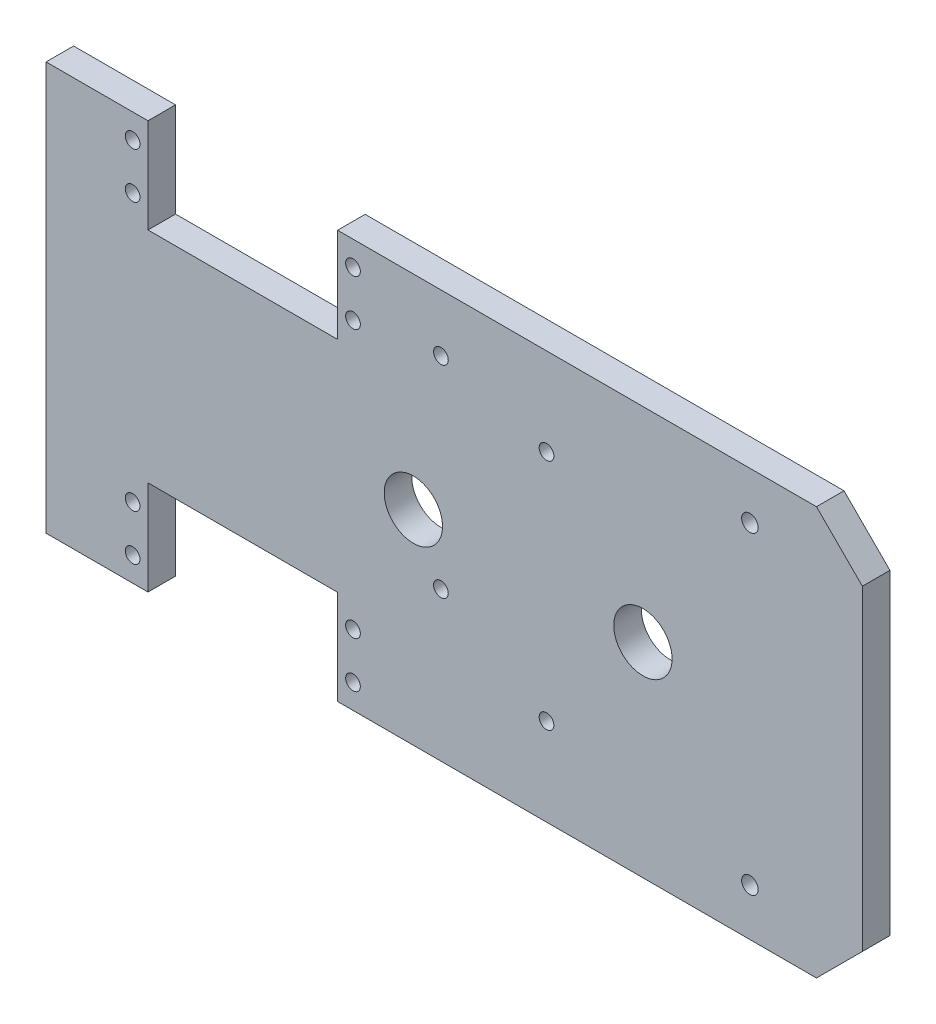
ISO-10303-21;
HEADER;
FILE_DESCRIPTION(('STEP AP214'),'2;1');
FILE_NAME('part.step','',(''),(''),'','','');
FILE_SCHEMA(('AUTOMOTIVE_DESIGN { 1 0 10303 214 1 1 1 1 }'));
ENDSEC;
DATA;
#1=APPLICATION_CONTEXT('core data for automotive mechanical design processes');
#2=APPLICATION_PROTOCOL_DEFINITION('international standard','automotive_design',2000,#1);
#3=PRODUCT_CONTEXT('',#1,'mechanical');
#4=PRODUCT('Part','Part','',(#3));
#5=PRODUCT_RELATED_PRODUCT_CATEGORY('part','',(#4));
#6=PRODUCT_DEFINITION_FORMATION('','',#4);
#7=PRODUCT_DEFINITION_CONTEXT('part definition',#1,'design');
#8=PRODUCT_DEFINITION('design','',#6,#7);
#9=PRODUCT_DEFINITION_SHAPE('','',#8);
#10=(LENGTH_UNIT() NAMED_UNIT(*) SI_UNIT(.MILLI.,.METRE.));
#11=(NAMED_UNIT(*) PLANE_ANGLE_UNIT() SI_UNIT($,.RADIAN.));
#12=(NAMED_UNIT(*) SI_UNIT($,.STERADIAN.) SOLID_ANGLE_UNIT());
#13=UNCERTAINTY_MEASURE_WITH_UNIT(LENGTH_MEASURE(1.E-05),#10,'distance_accuracy_value','');
#14=(GEOMETRIC_REPRESENTATION_CONTEXT(3) GLOBAL_UNCERTAINTY_ASSIGNED_CONTEXT((#13)) GLOBAL_UNIT_ASSIGNED_CONTEXT((#10,
#11,#12)) REPRESENTATION_CONTEXT('',''));
#15=CARTESIAN_POINT('',(0.,0.,0.));
#16=DIRECTION('',(0.,0.,1.));
#17=DIRECTION('',(1.,0.,0.));
#18=AXIS2_PLACEMENT_3D('',#15,#16,#17);
#19=CARTESIAN_POINT('',(0.,0.,6.));
#20=DIRECTION('',(0.,0.,1.));
#21=DIRECTION('',(1.,0.,0.));
#22=AXIS2_PLACEMENT_3D('',#19,#20,#21);
#23=PLANE('',#22);
#24=CARTESIAN_POINT('',(80.,0.,6.));
#25=DIRECTION('',(0.,0.,1.));
#26=DIRECTION('',(1.,0.,0.));
#27=AXIS2_PLACEMENT_3D('',#24,#25,#26);
#28=CIRCLE('',#27,6.34999999999999);
#29=CARTESIAN_POINT('',(86.35,0.,6.));
#30=VERTEX_POINT('',#29);
#31=EDGE_CURVE('E371',#30,#30,#28,.T.);
#32=ORIENTED_EDGE('',*,*,#31,.F.);
#33=EDGE_LOOP('',(#32));
#34=FACE_BOUND('',#33,.T.);
#35=CARTESIAN_POINT('',(86.,-12.,6.));
#36=DIRECTION('',(0.,0.,1.));
#37=DIRECTION('',(1.,0.,0.));
#38=AXIS2_PLACEMENT_3D('',#35,#36,#37);
#39=CIRCLE('',#38,1.6);
#40=CARTESIAN_POINT('',(87.6,-12.,6.));
#41=VERTEX_POINT('',#40);
#42=EDGE_CURVE('E382',#41,#41,#39,.T.);
#43=ORIENTED_EDGE('',*,*,#42,.F.);
#44=EDGE_LOOP('',(#43));
#45=FACE_BOUND('',#44,.T.);
#46=CARTESIAN_POINT('',(153.3,-34.15,6.));
#47=DIRECTION('',(0.,0.,1.));
#48=DIRECTION('',(1.,0.,0.));
#49=AXIS2_PLACEMENT_3D('',#46,#47,#48);
#50=CIRCLE('',#49,1.8);
#51=CARTESIAN_POINT('',(155.1,-34.15,6.));
#52=VERTEX_POINT('',#51);
#53=EDGE_CURVE('E393',#52,#52,#50,.T.);
#54=ORIENTED_EDGE('',*,*,#53,.F.);
#55=EDGE_LOOP('',(#54));
#56=FACE_BOUND('',#55,.T.);
#57=CARTESIAN_POINT('',(66.85,-29.15,6.));
#58=DIRECTION('',(0.,0.,1.));
#59=DIRECTION('',(1.,0.,0.));
#60=AXIS2_PLACEMENT_3D('',#57,#58,#59);
#61=CIRCLE('',#60,1.6);
#62=CARTESIAN_POINT('',(68.45,-29.15,6.));
#63=VERTEX_POINT('',#62);
#64=EDGE_CURVE('E410',#63,#63,#61,.T.);
#65=ORIENTED_EDGE('',*,*,#64,.F.);
#66=EDGE_LOOP('',(#65));
#67=FACE_BOUND('',#66,.T.);
#68=CARTESIAN_POINT('',(18.85,-29.15,6.));
#69=DIRECTION('',(0.,0.,1.));
#70=DIRECTION('',(1.,0.,0.));
#71=AXIS2_PLACEMENT_3D('',#68,#69,#70);
#72=CIRCLE('',#71,1.6);
#73=CARTESIAN_POINT('',(20.45,-29.15,6.));
#74=VERTEX_POINT('',#73);
#75=EDGE_CURVE('E420',#74,#74,#72,.T.);
#76=ORIENTED_EDGE('',*,*,#75,.F.);
#77=EDGE_LOOP('',(#76));
#78=FACE_BOUND('',#77,.T.);
#79=CARTESIAN_POINT('',(153.3,34.15,6.));
#80=DIRECTION('',(0.,0.,1.));
#81=DIRECTION('',(1.,0.,0.));
#82=AXIS2_PLACEMENT_3D('',#79,#80,#81);
#83=CIRCLE('',#82,1.8);
#84=CARTESIAN_POINT('',(155.1,34.15,6.));
#85=VERTEX_POINT('',#84);
#86=EDGE_CURVE('E431',#85,#85,#83,.T.);
#87=ORIENTED_EDGE('',*,*,#86,.F.);
#88=EDGE_LOOP('',(#87));
#89=FACE_BOUND('',#88,.T.);
#90=CARTESIAN_POINT('',(66.85,29.15,6.));
#91=DIRECTION('',(0.,0.,1.));
#92=DIRECTION('',(1.,0.,0.));
#93=AXIS2_PLACEMENT_3D('',#90,#91,#92);
#94=CIRCLE('',#93,1.6);
#95=CARTESIAN_POINT('',(68.45,29.15,6.));
#96=VERTEX_POINT('',#95);
#97=EDGE_CURVE('E444',#96,#96,#94,.T.);
#98=ORIENTED_EDGE('',*,*,#97,.F.);
#99=EDGE_LOOP('',(#98));
#100=FACE_BOUND('',#99,.T.);
#101=CARTESIAN_POINT('',(18.85,29.15,6.));
#102=DIRECTION('',(0.,0.,1.));
#103=DIRECTION('',(1.,0.,0.));
#104=AXIS2_PLACEMENT_3D('',#101,#102,#103);
#105=CIRCLE('',#104,1.6);
#106=CARTESIAN_POINT('',(20.45,29.15,6.));
#107=VERTEX_POINT('',#106);
#108=EDGE_CURVE('E176',#107,#107,#105,.T.);
#109=ORIENTED_EDGE('',*,*,#108,.F.);
#110=EDGE_LOOP('',(#109));
#111=FACE_BOUND('',#110,.T.);
#112=DIRECTION('',(0.,-1.,0.));
#113=VECTOR('',#112,1.);
#114=CARTESIAN_POINT('',(0.,44.45,6.));
#115=LINE('',#114,#113);
#116=CARTESIAN_POINT('',(0.,44.45,6.));
#117=VERTEX_POINT('',#116);
#118=CARTESIAN_POINT('',(0.,-44.45,6.));
#119=VERTEX_POINT('',#118);
#120=EDGE_CURVE('E200',#117,#119,#115,.T.);
#121=ORIENTED_EDGE('',*,*,#120,.T.);
#122=DIRECTION('',(1.,0.,0.));
#123=VECTOR('',#122,1.);
#124=CARTESIAN_POINT('',(0.,-44.45,6.));
#125=LINE('',#124,#123);
#126=CARTESIAN_POINT('',(22.2,-44.45,6.));
#127=VERTEX_POINT('',#126);
#128=EDGE_CURVE('E120',#119,#127,#125,.T.);
#129=ORIENTED_EDGE('',*,*,#128,.T.);
#130=DIRECTION('',(0.,1.,0.));
#131=VECTOR('',#130,1.);
#132=CARTESIAN_POINT('',(22.2,-44.45,6.));
#133=LINE('',#132,#131);
#134=CARTESIAN_POINT('',(22.2,-23.85,6.));
#135=VERTEX_POINT('',#134);
#136=EDGE_CURVE('E235',#127,#135,#133,.T.);
#137=ORIENTED_EDGE('',*,*,#136,.T.);
#138=DIRECTION('',(1.,0.,0.));
#139=VECTOR('',#138,1.);
#140=CARTESIAN_POINT('',(22.2,-23.85,6.));
#141=LINE('',#140,#139);
#142=CARTESIAN_POINT('',(63.5,-23.85,6.));
#143=VERTEX_POINT('',#142);
#144=EDGE_CURVE('E253',#135,#143,#141,.T.);
#145=ORIENTED_EDGE('',*,*,#144,.T.);
#146=DIRECTION('',(0.,-1.,0.));
#147=VECTOR('',#146,1.);
#148=CARTESIAN_POINT('',(63.5,-23.85,6.));
#149=LINE('',#148,#147);
#150=CARTESIAN_POINT('',(63.5,-44.45,6.));
#151=VERTEX_POINT('',#150);
#152=EDGE_CURVE('E247',#143,#151,#149,.T.);
#153=ORIENTED_EDGE('',*,*,#152,.T.);
#154=DIRECTION('',(1.,0.,0.));
#155=VECTOR('',#154,1.);
#156=CARTESIAN_POINT('',(63.5,-44.45,6.));
#157=LINE('',#156,#155);
#158=CARTESIAN_POINT('',(167.8,-44.45,6.));
#159=VERTEX_POINT('',#158);
#160=EDGE_CURVE('E249',#151,#159,#157,.T.);
#161=ORIENTED_EDGE('',*,*,#160,.T.);
#162=DIRECTION('',(0.707106781186548,0.707106781186547,0.));
#163=VECTOR('',#162,1.);
#164=CARTESIAN_POINT('',(167.8,-44.45,6.));
#165=LINE('',#164,#163);
#166=CARTESIAN_POINT('',(177.8,-34.45,6.));
#167=VERTEX_POINT('',#166);
#168=EDGE_CURVE('E251',#159,#167,#165,.T.);
#169=ORIENTED_EDGE('',*,*,#168,.T.);
#170=DIRECTION('',(0.,1.,0.));
#171=VECTOR('',#170,1.);
#172=CARTESIAN_POINT('',(177.8,-34.45,6.));
#173=LINE('',#172,#171);
#174=CARTESIAN_POINT('',(177.8,34.45,6.));
#175=VERTEX_POINT('',#174);
#176=EDGE_CURVE('E259',#167,#175,#173,.T.);
#177=ORIENTED_EDGE('',*,*,#176,.T.);
#178=DIRECTION('',(-0.707106781186548,0.707106781186547,0.));
#179=VECTOR('',#178,1.);
#180=CARTESIAN_POINT('',(177.8,34.45,6.));
#181=LINE('',#180,#179);
#182=CARTESIAN_POINT('',(167.8,44.45,6.));
#183=VERTEX_POINT('',#182);
#184=EDGE_CURVE('E261',#175,#183,#181,.T.);
#185=ORIENTED_EDGE('',*,*,#184,.T.);
#186=DIRECTION('',(-1.,0.,0.));
#187=VECTOR('',#186,1.);
#188=CARTESIAN_POINT('',(167.8,44.45,6.));
#189=LINE('',#188,#187);
#190=CARTESIAN_POINT('',(63.5,44.45,6.));
#191=VERTEX_POINT('',#190);
#192=EDGE_CURVE('E263',#183,#191,#189,.T.);
#193=ORIENTED_EDGE('',*,*,#192,.T.);
#194=DIRECTION('',(0.,-1.,0.));
#195=VECTOR('',#194,1.);
#196=CARTESIAN_POINT('',(63.5,44.45,6.));
#197=LINE('',#196,#195);
#198=CARTESIAN_POINT('',(63.5,23.85,6.));
#199=VERTEX_POINT('',#198);
#200=EDGE_CURVE('E152',#191,#199,#197,.T.);
#201=ORIENTED_EDGE('',*,*,#200,.T.);
#202=DIRECTION('',(-1.,0.,0.));
#203=VECTOR('',#202,1.);
#204=CARTESIAN_POINT('',(63.5,23.85,6.));
#205=LINE('',#204,#203);
#206=CARTESIAN_POINT('',(22.2,23.85,6.));
#207=VERTEX_POINT('',#206);
#208=EDGE_CURVE('E146',#199,#207,#205,.T.);
#209=ORIENTED_EDGE('',*,*,#208,.T.);
#210=DIRECTION('',(0.,1.,0.));
#211=VECTOR('',#210,1.);
#212=CARTESIAN_POINT('',(22.2,23.85,6.));
#213=LINE('',#212,#211);
#214=CARTESIAN_POINT('',(22.2,44.45,6.));
#215=VERTEX_POINT('',#214);
#216=EDGE_CURVE('E155',#207,#215,#213,.T.);
#217=ORIENTED_EDGE('',*,*,#216,.T.);
#218=DIRECTION('',(-1.,0.,0.));
#219=VECTOR('',#218,1.);
#220=CARTESIAN_POINT('',(22.2,44.45,6.));
#221=LINE('',#220,#219);
#222=EDGE_CURVE('E57',#215,#117,#221,.T.);
#223=ORIENTED_EDGE('',*,*,#222,.T.);
#224=EDGE_LOOP('',(#121,#129,#137,#145,#153,#161,#169,#177,#185,#193,#201,#209,#217,#223));
#225=FACE_BOUND('',#224,.T.);
#226=CARTESIAN_POINT('',(18.85,39.15,6.));
#227=DIRECTION('',(0.,0.,1.));
#228=DIRECTION('',(1.,0.,0.));
#229=AXIS2_PLACEMENT_3D('',#226,#227,#228);
#230=CIRCLE('',#229,1.6);
#231=CARTESIAN_POINT('',(20.45,39.15,6.));
#232=VERTEX_POINT('',#231);
#233=EDGE_CURVE('E446',#232,#232,#230,.T.);
#234=ORIENTED_EDGE('',*,*,#233,.F.);
#235=EDGE_LOOP('',(#234));
#236=FACE_BOUND('',#235,.T.);
#237=CARTESIAN_POINT('',(66.85,39.15,6.));
#238=DIRECTION('',(0.,0.,1.));
#239=DIRECTION('',(1.,0.,0.));
#240=AXIS2_PLACEMENT_3D('',#237,#238,#239);
#241=CIRCLE('',#240,1.6);
#242=CARTESIAN_POINT('',(68.45,39.15,6.));
#243=VERTEX_POINT('',#242);
#244=EDGE_CURVE('E440',#243,#243,#241,.T.);
#245=ORIENTED_EDGE('',*,*,#244,.F.);
#246=EDGE_LOOP('',(#245));
#247=FACE_BOUND('',#246,.T.);
#248=CARTESIAN_POINT('',(109.,25.4,6.));
#249=DIRECTION('',(0.,0.,1.));
#250=DIRECTION('',(1.,0.,0.));
#251=AXIS2_PLACEMENT_3D('',#248,#249,#250);
#252=CIRCLE('',#251,1.6);
#253=CARTESIAN_POINT('',(110.6,25.4,6.));
#254=VERTEX_POINT('',#253);
#255=EDGE_CURVE('E422',#254,#254,#252,.T.);
#256=ORIENTED_EDGE('',*,*,#255,.F.);
#257=EDGE_LOOP('',(#256));
#258=FACE_BOUND('',#257,.T.);
#259=CARTESIAN_POINT('',(18.85,-39.15,6.));
#260=DIRECTION('',(0.,0.,1.));
#261=DIRECTION('',(1.,0.,0.));
#262=AXIS2_PLACEMENT_3D('',#259,#260,#261);
#263=CIRCLE('',#262,1.6);
#264=CARTESIAN_POINT('',(20.45,-39.15,6.));
#265=VERTEX_POINT('',#264);
#266=EDGE_CURVE('E412',#265,#265,#263,.T.);
#267=ORIENTED_EDGE('',*,*,#266,.F.);
#268=EDGE_LOOP('',(#267));
#269=FACE_BOUND('',#268,.T.);
#270=CARTESIAN_POINT('',(66.85,-39.15,6.));
#271=DIRECTION('',(0.,0.,1.));
#272=DIRECTION('',(1.,0.,0.));
#273=AXIS2_PLACEMENT_3D('',#270,#271,#272);
#274=CIRCLE('',#273,1.6);
#275=CARTESIAN_POINT('',(68.45,-39.15,6.));
#276=VERTEX_POINT('',#275);
#277=EDGE_CURVE('E402',#276,#276,#274,.T.);
#278=ORIENTED_EDGE('',*,*,#277,.F.);
#279=EDGE_LOOP('',(#278));
#280=FACE_BOUND('',#279,.T.);
#281=CARTESIAN_POINT('',(109.,-25.4,6.));
#282=DIRECTION('',(0.,0.,1.));
#283=DIRECTION('',(1.,0.,0.));
#284=AXIS2_PLACEMENT_3D('',#281,#282,#283);
#285=CIRCLE('',#284,1.6);
#286=CARTESIAN_POINT('',(110.6,-25.4,6.));
#287=VERTEX_POINT('',#286);
#288=EDGE_CURVE('E386',#287,#287,#285,.T.);
#289=ORIENTED_EDGE('',*,*,#288,.F.);
#290=EDGE_LOOP('',(#289));
#291=FACE_BOUND('',#290,.T.);
#292=CARTESIAN_POINT('',(86.,32.,6.));
#293=DIRECTION('',(0.,0.,1.));
#294=DIRECTION('',(1.,0.,0.));
#295=AXIS2_PLACEMENT_3D('',#292,#293,#294);
#296=CIRCLE('',#295,1.6);
#297=CARTESIAN_POINT('',(87.6,32.,6.));
#298=VERTEX_POINT('',#297);
#299=EDGE_CURVE('E380',#298,#298,#296,.T.);
#300=ORIENTED_EDGE('',*,*,#299,.F.);
#301=EDGE_LOOP('',(#300));
#302=FACE_BOUND('',#301,.T.);
#303=CARTESIAN_POINT('',(130.,0.,6.));
#304=DIRECTION('',(0.,0.,1.));
#305=DIRECTION('',(1.,0.,0.));
#306=AXIS2_PLACEMENT_3D('',#303,#304,#305);
#307=CIRCLE('',#306,6.34999999999999);
#308=CARTESIAN_POINT('',(136.35,0.,6.));
#309=VERTEX_POINT('',#308);
#310=EDGE_CURVE('E362',#309,#309,#307,.T.);
#311=ORIENTED_EDGE('',*,*,#310,.F.);
#312=EDGE_LOOP('',(#311));
#313=FACE_BOUND('',#312,.T.);
#314=ADVANCED_FACE('F39',(#34,#45,#56,#67,#78,#89,#100,#111,#225,#236,#247,#258,#269,#280,#291,
#302,#313),#23,.T.);
#315=CARTESIAN_POINT('',(0.,0.,0.));
#316=DIRECTION('',(0.,0.,1.));
#317=DIRECTION('',(1.,0.,0.));
#318=AXIS2_PLACEMENT_3D('',#315,#316,#317);
#319=PLANE('',#318);
#320=DIRECTION('',(0.,-1.,0.));
#321=VECTOR('',#320,1.);
#322=CARTESIAN_POINT('',(0.,44.45,0.));
#323=LINE('',#322,#321);
#324=CARTESIAN_POINT('',(0.,44.45,0.));
#325=VERTEX_POINT('',#324);
#326=CARTESIAN_POINT('',(0.,-44.45,0.));
#327=VERTEX_POINT('',#326);
#328=EDGE_CURVE('E175',#325,#327,#323,.T.);
#329=ORIENTED_EDGE('',*,*,#328,.F.);
#330=DIRECTION('',(-1.,0.,0.));
#331=VECTOR('',#330,1.);
#332=CARTESIAN_POINT('',(22.2,44.45,0.));
#333=LINE('',#332,#331);
#334=CARTESIAN_POINT('',(22.2,44.45,0.));
#335=VERTEX_POINT('',#334);
#336=EDGE_CURVE('E108',#335,#325,#333,.T.);
#337=ORIENTED_EDGE('',*,*,#336,.F.);
#338=DIRECTION('',(0.,1.,0.));
#339=VECTOR('',#338,1.);
#340=CARTESIAN_POINT('',(22.2,23.85,0.));
#341=LINE('',#340,#339);
#342=CARTESIAN_POINT('',(22.2,23.85,0.));
#343=VERTEX_POINT('',#342);
#344=EDGE_CURVE('E103',#343,#335,#341,.T.);
#345=ORIENTED_EDGE('',*,*,#344,.F.);
#346=DIRECTION('',(-1.,0.,0.));
#347=VECTOR('',#346,1.);
#348=CARTESIAN_POINT('',(63.5,23.85,0.));
#349=LINE('',#348,#347);
#350=CARTESIAN_POINT('',(63.5,23.85,0.));
#351=VERTEX_POINT('',#350);
#352=EDGE_CURVE('E165',#351,#343,#349,.T.);
#353=ORIENTED_EDGE('',*,*,#352,.F.);
#354=DIRECTION('',(0.,-1.,0.));
#355=VECTOR('',#354,1.);
#356=CARTESIAN_POINT('',(63.5,44.45,0.));
#357=LINE('',#356,#355);
#358=CARTESIAN_POINT('',(63.5,44.45,0.));
#359=VERTEX_POINT('',#358);
#360=EDGE_CURVE('E193',#359,#351,#357,.T.);
#361=ORIENTED_EDGE('',*,*,#360,.F.);
#362=DIRECTION('',(-1.,0.,0.));
#363=VECTOR('',#362,1.);
#364=CARTESIAN_POINT('',(167.8,44.45,0.));
#365=LINE('',#364,#363);
#366=CARTESIAN_POINT('',(167.8,44.45,0.));
#367=VERTEX_POINT('',#366);
#368=EDGE_CURVE('E195',#367,#359,#365,.T.);
#369=ORIENTED_EDGE('',*,*,#368,.F.);
#370=DIRECTION('',(-0.707106781186548,0.707106781186547,0.));
#371=VECTOR('',#370,1.);
#372=CARTESIAN_POINT('',(177.8,34.45,0.));
#373=LINE('',#372,#371);
#374=CARTESIAN_POINT('',(177.8,34.45,0.));
#375=VERTEX_POINT('',#374);
#376=EDGE_CURVE('E188',#375,#367,#373,.T.);
#377=ORIENTED_EDGE('',*,*,#376,.F.);
#378=DIRECTION('',(0.,1.,0.));
#379=VECTOR('',#378,1.);
#380=CARTESIAN_POINT('',(177.8,-34.45,0.));
#381=LINE('',#380,#379);
#382=CARTESIAN_POINT('',(177.8,-34.45,0.));
#383=VERTEX_POINT('',#382);
#384=EDGE_CURVE('E189',#383,#375,#381,.T.);
#385=ORIENTED_EDGE('',*,*,#384,.F.);
#386=DIRECTION('',(0.707106781186548,0.707106781186547,0.));
#387=VECTOR('',#386,1.);
#388=CARTESIAN_POINT('',(167.8,-44.45,0.));
#389=LINE('',#388,#387);
#390=CARTESIAN_POINT('',(167.8,-44.45,0.));
#391=VERTEX_POINT('',#390);
#392=EDGE_CURVE('E187',#391,#383,#389,.T.);
#393=ORIENTED_EDGE('',*,*,#392,.F.);
#394=DIRECTION('',(1.,0.,0.));
#395=VECTOR('',#394,1.);
#396=CARTESIAN_POINT('',(63.5,-44.45,0.));
#397=LINE('',#396,#395);
#398=CARTESIAN_POINT('',(63.5,-44.45,0.));
#399=VERTEX_POINT('',#398);
#400=EDGE_CURVE('E184',#399,#391,#397,.T.);
#401=ORIENTED_EDGE('',*,*,#400,.F.);
#402=DIRECTION('',(0.,-1.,0.));
#403=VECTOR('',#402,1.);
#404=CARTESIAN_POINT('',(63.5,-23.85,0.));
#405=LINE('',#404,#403);
#406=CARTESIAN_POINT('',(63.5,-23.85,0.));
#407=VERTEX_POINT('',#406);
#408=EDGE_CURVE('E185',#407,#399,#405,.T.);
#409=ORIENTED_EDGE('',*,*,#408,.F.);
#410=DIRECTION('',(1.,0.,0.));
#411=VECTOR('',#410,1.);
#412=CARTESIAN_POINT('',(22.2,-23.85,0.));
#413=LINE('',#412,#411);
#414=CARTESIAN_POINT('',(22.2,-23.85,0.));
#415=VERTEX_POINT('',#414);
#416=EDGE_CURVE('E179',#415,#407,#413,.T.);
#417=ORIENTED_EDGE('',*,*,#416,.F.);
#418=DIRECTION('',(0.,1.,0.));
#419=VECTOR('',#418,1.);
#420=CARTESIAN_POINT('',(22.2,-44.45,0.));
#421=LINE('',#420,#419);
#422=CARTESIAN_POINT('',(22.2,-44.45,0.));
#423=VERTEX_POINT('',#422);
#424=EDGE_CURVE('E177',#423,#415,#421,.T.);
#425=ORIENTED_EDGE('',*,*,#424,.F.);
#426=DIRECTION('',(1.,0.,0.));
#427=VECTOR('',#426,1.);
#428=CARTESIAN_POINT('',(0.,-44.45,0.));
#429=LINE('',#428,#427);
#430=EDGE_CURVE('E173',#327,#423,#429,.T.);
#431=ORIENTED_EDGE('',*,*,#430,.F.);
#432=EDGE_LOOP('',(#329,#337,#345,#353,#361,#369,#377,#385,#393,#401,#409,#417,#425,#431));
#433=FACE_BOUND('',#432,.T.);
#434=CARTESIAN_POINT('',(18.85,29.15,0.));
#435=DIRECTION('',(0.,0.,1.));
#436=DIRECTION('',(1.,0.,0.));
#437=AXIS2_PLACEMENT_3D('',#434,#435,#436);
#438=CIRCLE('',#437,1.6);
#439=CARTESIAN_POINT('',(20.45,29.15,0.));
#440=VERTEX_POINT('',#439);
#441=EDGE_CURVE('E455',#440,#440,#438,.T.);
#442=ORIENTED_EDGE('',*,*,#441,.T.);
#443=EDGE_LOOP('',(#442));
#444=FACE_BOUND('',#443,.T.);
#445=CARTESIAN_POINT('',(18.85,39.15,0.));
#446=DIRECTION('',(0.,0.,1.));
#447=DIRECTION('',(1.,0.,0.));
#448=AXIS2_PLACEMENT_3D('',#445,#446,#447);
#449=CIRCLE('',#448,1.6);
#450=CARTESIAN_POINT('',(20.45,39.15,0.));
#451=VERTEX_POINT('',#450);
#452=EDGE_CURVE('E447',#451,#451,#449,.T.);
#453=ORIENTED_EDGE('',*,*,#452,.T.);
#454=EDGE_LOOP('',(#453));
#455=FACE_BOUND('',#454,.T.);
#456=CARTESIAN_POINT('',(66.85,29.15,0.));
#457=DIRECTION('',(0.,0.,1.));
#458=DIRECTION('',(1.,0.,0.));
#459=AXIS2_PLACEMENT_3D('',#456,#457,#458);
#460=CIRCLE('',#459,1.6);
#461=CARTESIAN_POINT('',(68.45,29.15,0.));
#462=VERTEX_POINT('',#461);
#463=EDGE_CURVE('E439',#462,#462,#460,.T.);
#464=ORIENTED_EDGE('',*,*,#463,.T.);
#465=EDGE_LOOP('',(#464));
#466=FACE_BOUND('',#465,.T.);
#467=CARTESIAN_POINT('',(66.85,39.15,0.));
#468=DIRECTION('',(0.,0.,1.));
#469=DIRECTION('',(1.,0.,0.));
#470=AXIS2_PLACEMENT_3D('',#467,#468,#469);
#471=CIRCLE('',#470,1.6);
#472=CARTESIAN_POINT('',(68.45,39.15,0.));
#473=VERTEX_POINT('',#472);
#474=EDGE_CURVE('E432',#473,#473,#471,.T.);
#475=ORIENTED_EDGE('',*,*,#474,.T.);
#476=EDGE_LOOP('',(#475));
#477=FACE_BOUND('',#476,.T.);
#478=CARTESIAN_POINT('',(153.3,34.15,0.));
#479=DIRECTION('',(0.,0.,1.));
#480=DIRECTION('',(1.,0.,0.));
#481=AXIS2_PLACEMENT_3D('',#478,#479,#480);
#482=CIRCLE('',#481,1.8);
#483=CARTESIAN_POINT('',(155.1,34.15,0.));
#484=VERTEX_POINT('',#483);
#485=EDGE_CURVE('E428',#484,#484,#482,.T.);
#486=ORIENTED_EDGE('',*,*,#485,.T.);
#487=EDGE_LOOP('',(#486));
#488=FACE_BOUND('',#487,.T.);
#489=CARTESIAN_POINT('',(109.,25.4,0.));
#490=DIRECTION('',(0.,0.,1.));
#491=DIRECTION('',(1.,0.,0.));
#492=AXIS2_PLACEMENT_3D('',#489,#490,#491);
#493=CIRCLE('',#492,1.6);
#494=CARTESIAN_POINT('',(110.6,25.4,0.));
#495=VERTEX_POINT('',#494);
#496=EDGE_CURVE('E425',#495,#495,#493,.T.);
#497=ORIENTED_EDGE('',*,*,#496,.T.);
#498=EDGE_LOOP('',(#497));
#499=FACE_BOUND('',#498,.T.);
#500=CARTESIAN_POINT('',(18.85,-29.15,0.));
#501=DIRECTION('',(0.,0.,1.));
#502=DIRECTION('',(1.,0.,0.));
#503=AXIS2_PLACEMENT_3D('',#500,#501,#502);
#504=CIRCLE('',#503,1.6);
#505=CARTESIAN_POINT('',(20.45,-29.15,0.));
#506=VERTEX_POINT('',#505);
#507=EDGE_CURVE('E418',#506,#506,#504,.T.);
#508=ORIENTED_EDGE('',*,*,#507,.T.);
#509=EDGE_LOOP('',(#508));
#510=FACE_BOUND('',#509,.T.);
#511=CARTESIAN_POINT('',(18.85,-39.15,0.));
#512=DIRECTION('',(0.,0.,1.));
#513=DIRECTION('',(1.,0.,0.));
#514=AXIS2_PLACEMENT_3D('',#511,#512,#513);
#515=CIRCLE('',#514,1.6);
#516=CARTESIAN_POINT('',(20.45,-39.15,0.));
#517=VERTEX_POINT('',#516);
#518=EDGE_CURVE('E408',#517,#517,#515,.T.);
#519=ORIENTED_EDGE('',*,*,#518,.T.);
#520=EDGE_LOOP('',(#519));
#521=FACE_BOUND('',#520,.T.);
#522=CARTESIAN_POINT('',(66.85,-29.15,0.));
#523=DIRECTION('',(0.,0.,1.));
#524=DIRECTION('',(1.,0.,0.));
#525=AXIS2_PLACEMENT_3D('',#522,#523,#524);
#526=CIRCLE('',#525,1.6);
#527=CARTESIAN_POINT('',(68.45,-29.15,0.));
#528=VERTEX_POINT('',#527);
#529=EDGE_CURVE('E404',#528,#528,#526,.T.);
#530=ORIENTED_EDGE('',*,*,#529,.T.);
#531=EDGE_LOOP('',(#530));
#532=FACE_BOUND('',#531,.T.);
#533=CARTESIAN_POINT('',(66.85,-39.15,0.));
#534=DIRECTION('',(0.,0.,1.));
#535=DIRECTION('',(1.,0.,0.));
#536=AXIS2_PLACEMENT_3D('',#533,#534,#535);
#537=CIRCLE('',#536,1.6);
#538=CARTESIAN_POINT('',(68.45,-39.15,0.));
#539=VERTEX_POINT('',#538);
#540=EDGE_CURVE('E397',#539,#539,#537,.T.);
#541=ORIENTED_EDGE('',*,*,#540,.T.);
#542=EDGE_LOOP('',(#541));
#543=FACE_BOUND('',#542,.T.);
#544=CARTESIAN_POINT('',(153.3,-34.15,0.));
#545=DIRECTION('',(0.,0.,1.));
#546=DIRECTION('',(1.,0.,0.));
#547=AXIS2_PLACEMENT_3D('',#544,#545,#546);
#548=CIRCLE('',#547,1.8);
#549=CARTESIAN_POINT('',(155.1,-34.15,0.));
#550=VERTEX_POINT('',#549);
#551=EDGE_CURVE('E395',#550,#550,#548,.T.);
#552=ORIENTED_EDGE('',*,*,#551,.T.);
#553=EDGE_LOOP('',(#552));
#554=FACE_BOUND('',#553,.T.);
#555=CARTESIAN_POINT('',(109.,-25.4,0.));
#556=DIRECTION('',(0.,0.,1.));
#557=DIRECTION('',(1.,0.,0.));
#558=AXIS2_PLACEMENT_3D('',#555,#556,#557);
#559=CIRCLE('',#558,1.6);
#560=CARTESIAN_POINT('',(110.6,-25.4,0.));
#561=VERTEX_POINT('',#560);
#562=EDGE_CURVE('E387',#561,#561,#559,.T.);
#563=ORIENTED_EDGE('',*,*,#562,.T.);
#564=EDGE_LOOP('',(#563));
#565=FACE_BOUND('',#564,.T.);
#566=CARTESIAN_POINT('',(86.,-12.,0.));
#567=DIRECTION('',(0.,0.,1.));
#568=DIRECTION('',(1.,0.,0.));
#569=AXIS2_PLACEMENT_3D('',#566,#567,#568);
#570=CIRCLE('',#569,1.6);
#571=CARTESIAN_POINT('',(87.6,-12.,0.));
#572=VERTEX_POINT('',#571);
#573=EDGE_CURVE('E379',#572,#572,#570,.T.);
#574=ORIENTED_EDGE('',*,*,#573,.T.);
#575=EDGE_LOOP('',(#574));
#576=FACE_BOUND('',#575,.T.);
#577=CARTESIAN_POINT('',(86.,32.,0.));
#578=DIRECTION('',(0.,0.,1.));
#579=DIRECTION('',(1.,0.,0.));
#580=AXIS2_PLACEMENT_3D('',#577,#578,#579);
#581=CIRCLE('',#580,1.6);
#582=CARTESIAN_POINT('',(87.6,32.,0.));
#583=VERTEX_POINT('',#582);
#584=EDGE_CURVE('E372',#583,#583,#581,.T.);
#585=ORIENTED_EDGE('',*,*,#584,.T.);
#586=EDGE_LOOP('',(#585));
#587=FACE_BOUND('',#586,.T.);
#588=CARTESIAN_POINT('',(80.,0.,0.));
#589=DIRECTION('',(0.,0.,1.));
#590=DIRECTION('',(1.,0.,0.));
#591=AXIS2_PLACEMENT_3D('',#588,#589,#590);
#592=CIRCLE('',#591,6.34999999999999);
#593=CARTESIAN_POINT('',(86.35,0.,0.));
#594=VERTEX_POINT('',#593);
#595=EDGE_CURVE('E366',#594,#594,#592,.T.);
#596=ORIENTED_EDGE('',*,*,#595,.T.);
#597=EDGE_LOOP('',(#596));
#598=FACE_BOUND('',#597,.T.);
#599=CARTESIAN_POINT('',(130.,0.,0.));
#600=DIRECTION('',(0.,0.,1.));
#601=DIRECTION('',(1.,0.,0.));
#602=AXIS2_PLACEMENT_3D('',#599,#600,#601);
#603=CIRCLE('',#602,6.34999999999999);
#604=CARTESIAN_POINT('',(136.35,0.,0.));
#605=VERTEX_POINT('',#604);
#606=EDGE_CURVE('E364',#605,#605,#603,.T.);
#607=ORIENTED_EDGE('',*,*,#606,.T.);
#608=EDGE_LOOP('',(#607));
#609=FACE_BOUND('',#608,.T.);
#610=ADVANCED_FACE('F237',(#433,#444,#455,#466,#477,#488,#499,#510,#521,#532,#543,#554,#565,
#576,#587,#598,#609),#319,.F.);
#611=CARTESIAN_POINT('',(0.,44.45,6.));
#612=DIRECTION('',(1.,0.,0.));
#613=DIRECTION('',(0.,0.,-1.));
#614=AXIS2_PLACEMENT_3D('',#611,#612,#613);
#615=PLANE('',#614);
#616=ORIENTED_EDGE('',*,*,#328,.T.);
#617=DIRECTION('',(0.,0.,-1.));
#618=VECTOR('',#617,1.);
#619=CARTESIAN_POINT('',(0.,-44.45,6.));
#620=LINE('',#619,#618);
#621=EDGE_CURVE('E11',#119,#327,#620,.T.);
#622=ORIENTED_EDGE('',*,*,#621,.F.);
#623=ORIENTED_EDGE('',*,*,#120,.F.);
#624=DIRECTION('',(0.,0.,-1.));
#625=VECTOR('',#624,1.);
#626=CARTESIAN_POINT('',(0.,44.45,6.));
#627=LINE('',#626,#625);
#628=EDGE_CURVE('E169',#117,#325,#627,.T.);
#629=ORIENTED_EDGE('',*,*,#628,.T.);
#630=EDGE_LOOP('',(#616,#622,#623,#629));
#631=FACE_BOUND('',#630,.T.);
#632=ADVANCED_FACE('F41',(#631),#615,.F.);
#633=CARTESIAN_POINT('',(0.,-44.45,6.));
#634=DIRECTION('',(0.,1.,0.));
#635=DIRECTION('',(0.,0.,1.));
#636=AXIS2_PLACEMENT_3D('',#633,#634,#635);
#637=PLANE('',#636);
#638=ORIENTED_EDGE('',*,*,#430,.T.);
#639=DIRECTION('',(0.,0.,-1.));
#640=VECTOR('',#639,1.);
#641=CARTESIAN_POINT('',(22.2,-44.45,6.));
#642=LINE('',#641,#640);
#643=EDGE_CURVE('E48',#127,#423,#642,.T.);
#644=ORIENTED_EDGE('',*,*,#643,.F.);
#645=ORIENTED_EDGE('',*,*,#128,.F.);
#646=ORIENTED_EDGE('',*,*,#621,.T.);
#647=EDGE_LOOP('',(#638,#644,#645,#646));
#648=FACE_BOUND('',#647,.T.);
#649=ADVANCED_FACE('F706',(#648),#637,.F.);
#650=CARTESIAN_POINT('',(22.2,-44.45,6.));
#651=DIRECTION('',(-1.,0.,0.));
#652=DIRECTION('',(0.,0.,1.));
#653=AXIS2_PLACEMENT_3D('',#650,#651,#652);
#654=PLANE('',#653);
#655=ORIENTED_EDGE('',*,*,#424,.T.);
#656=DIRECTION('',(0.,0.,-1.));
#657=VECTOR('',#656,1.);
#658=CARTESIAN_POINT('',(22.2,-23.85,6.));
#659=LINE('',#658,#657);
#660=EDGE_CURVE('E221',#135,#415,#659,.T.);
#661=ORIENTED_EDGE('',*,*,#660,.F.);
#662=ORIENTED_EDGE('',*,*,#136,.F.);
#663=ORIENTED_EDGE('',*,*,#643,.T.);
#664=EDGE_LOOP('',(#655,#661,#662,#663));
#665=FACE_BOUND('',#664,.T.);
#666=ADVANCED_FACE('F228',(#665),#654,.F.);
#667=CARTESIAN_POINT('',(22.2,-23.85,6.));
#668=DIRECTION('',(0.,1.,0.));
#669=DIRECTION('',(0.,0.,1.));
#670=AXIS2_PLACEMENT_3D('',#667,#668,#669);
#671=PLANE('',#670);
#672=ORIENTED_EDGE('',*,*,#416,.T.);
#673=DIRECTION('',(0.,0.,-1.));
#674=VECTOR('',#673,1.);
#675=CARTESIAN_POINT('',(63.5,-23.85,6.));
#676=LINE('',#675,#674);
#677=EDGE_CURVE('E222',#143,#407,#676,.T.);
#678=ORIENTED_EDGE('',*,*,#677,.F.);
#679=ORIENTED_EDGE('',*,*,#144,.F.);
#680=ORIENTED_EDGE('',*,*,#660,.T.);
#681=EDGE_LOOP('',(#672,#678,#679,#680));
#682=FACE_BOUND('',#681,.T.);
#683=ADVANCED_FACE('F245',(#682),#671,.F.);
#684=CARTESIAN_POINT('',(63.5,-23.85,6.));
#685=DIRECTION('',(1.,0.,0.));
#686=DIRECTION('',(0.,0.,-1.));
#687=AXIS2_PLACEMENT_3D('',#684,#685,#686);
#688=PLANE('',#687);
#689=ORIENTED_EDGE('',*,*,#408,.T.);
#690=DIRECTION('',(0.,0.,-1.));
#691=VECTOR('',#690,1.);
#692=CARTESIAN_POINT('',(63.5,-44.45,6.));
#693=LINE('',#692,#691);
#694=EDGE_CURVE('E217',#151,#399,#693,.T.);
#695=ORIENTED_EDGE('',*,*,#694,.F.);
#696=ORIENTED_EDGE('',*,*,#152,.F.);
#697=ORIENTED_EDGE('',*,*,#677,.T.);
#698=EDGE_LOOP('',(#689,#695,#696,#697));
#699=FACE_BOUND('',#698,.T.);
#700=ADVANCED_FACE('F246',(#699),#688,.F.);
#701=CARTESIAN_POINT('',(63.5,-44.45,6.));
#702=DIRECTION('',(0.,1.,0.));
#703=DIRECTION('',(0.,0.,1.));
#704=AXIS2_PLACEMENT_3D('',#701,#702,#703);
#705=PLANE('',#704);
#706=ORIENTED_EDGE('',*,*,#400,.T.);
#707=DIRECTION('',(0.,0.,-1.));
#708=VECTOR('',#707,1.);
#709=CARTESIAN_POINT('',(167.8,-44.45,6.));
#710=LINE('',#709,#708);
#711=EDGE_CURVE('E214',#159,#391,#710,.T.);
#712=ORIENTED_EDGE('',*,*,#711,.F.);
#713=ORIENTED_EDGE('',*,*,#160,.F.);
#714=ORIENTED_EDGE('',*,*,#694,.T.);
#715=EDGE_LOOP('',(#706,#712,#713,#714));
#716=FACE_BOUND('',#715,.T.);
#717=ADVANCED_FACE('F671',(#716),#705,.F.);
#718=CARTESIAN_POINT('',(167.8,-44.45,6.));
#719=DIRECTION('',(-0.707106781186547,0.707106781186548,0.));
#720=DIRECTION('',(-0.707106781186548,-0.707106781186547,0.));
#721=AXIS2_PLACEMENT_3D('',#718,#719,#720);
#722=PLANE('',#721);
#723=ORIENTED_EDGE('',*,*,#392,.T.);
#724=DIRECTION('',(0.,0.,-1.));
#725=VECTOR('',#724,1.);
#726=CARTESIAN_POINT('',(177.8,-34.45,6.));
#727=LINE('',#726,#725);
#728=EDGE_CURVE('E215',#167,#383,#727,.T.);
#729=ORIENTED_EDGE('',*,*,#728,.F.);
#730=ORIENTED_EDGE('',*,*,#168,.F.);
#731=ORIENTED_EDGE('',*,*,#711,.T.);
#732=EDGE_LOOP('',(#723,#729,#730,#731));
#733=FACE_BOUND('',#732,.T.);
#734=ADVANCED_FACE('F662',(#733),#722,.F.);
#735=CARTESIAN_POINT('',(177.8,-34.45,6.));
#736=DIRECTION('',(-1.,0.,0.));
#737=DIRECTION('',(0.,0.,1.));
#738=AXIS2_PLACEMENT_3D('',#735,#736,#737);
#739=PLANE('',#738);
#740=ORIENTED_EDGE('',*,*,#384,.T.);
#741=DIRECTION('',(0.,0.,-1.));
#742=VECTOR('',#741,1.);
#743=CARTESIAN_POINT('',(177.8,34.45,6.));
#744=LINE('',#743,#742);
#745=EDGE_CURVE('E207',#175,#375,#744,.T.);
#746=ORIENTED_EDGE('',*,*,#745,.F.);
#747=ORIENTED_EDGE('',*,*,#176,.F.);
#748=ORIENTED_EDGE('',*,*,#728,.T.);
#749=EDGE_LOOP('',(#740,#746,#747,#748));
#750=FACE_BOUND('',#749,.T.);
#751=ADVANCED_FACE('F651',(#750),#739,.F.);
#752=CARTESIAN_POINT('',(177.8,34.45,6.));
#753=DIRECTION('',(-0.707106781186547,-0.707106781186548,0.));
#754=DIRECTION('',(0.707106781186548,-0.707106781186547,0.));
#755=AXIS2_PLACEMENT_3D('',#752,#753,#754);
#756=PLANE('',#755);
#757=ORIENTED_EDGE('',*,*,#376,.T.);
#758=DIRECTION('',(0.,0.,-1.));
#759=VECTOR('',#758,1.);
#760=CARTESIAN_POINT('',(167.8,44.45,6.));
#761=LINE('',#760,#759);
#762=EDGE_CURVE('E206',#183,#367,#761,.T.);
#763=ORIENTED_EDGE('',*,*,#762,.F.);
#764=ORIENTED_EDGE('',*,*,#184,.F.);
#765=ORIENTED_EDGE('',*,*,#745,.T.);
#766=EDGE_LOOP('',(#757,#763,#764,#765));
#767=FACE_BOUND('',#766,.T.);
#768=ADVANCED_FACE('F645',(#767),#756,.F.);
#769=CARTESIAN_POINT('',(167.8,44.45,6.));
#770=DIRECTION('',(0.,-1.,0.));
#771=DIRECTION('',(0.,0.,-1.));
#772=AXIS2_PLACEMENT_3D('',#769,#770,#771);
#773=PLANE('',#772);
#774=ORIENTED_EDGE('',*,*,#368,.T.);
#775=DIRECTION('',(0.,0.,-1.));
#776=VECTOR('',#775,1.);
#777=CARTESIAN_POINT('',(63.5,44.45,6.));
#778=LINE('',#777,#776);
#779=EDGE_CURVE('E201',#191,#359,#778,.T.);
#780=ORIENTED_EDGE('',*,*,#779,.F.);
#781=ORIENTED_EDGE('',*,*,#192,.F.);
#782=ORIENTED_EDGE('',*,*,#762,.T.);
#783=EDGE_LOOP('',(#774,#780,#781,#782));
#784=FACE_BOUND('',#783,.T.);
#785=ADVANCED_FACE('F267',(#784),#773,.F.);
#786=CARTESIAN_POINT('',(63.5,44.45,6.));
#787=DIRECTION('',(1.,0.,0.));
#788=DIRECTION('',(0.,0.,-1.));
#789=AXIS2_PLACEMENT_3D('',#786,#787,#788);
#790=PLANE('',#789);
#791=ORIENTED_EDGE('',*,*,#360,.T.);
#792=DIRECTION('',(0.,0.,-1.));
#793=VECTOR('',#792,1.);
#794=CARTESIAN_POINT('',(63.5,23.85,6.));
#795=LINE('',#794,#793);
#796=EDGE_CURVE('E162',#199,#351,#795,.T.);
#797=ORIENTED_EDGE('',*,*,#796,.F.);
#798=ORIENTED_EDGE('',*,*,#200,.F.);
#799=ORIENTED_EDGE('',*,*,#779,.T.);
#800=EDGE_LOOP('',(#791,#797,#798,#799));
#801=FACE_BOUND('',#800,.T.);
#802=ADVANCED_FACE('F272',(#801),#790,.F.);
#803=CARTESIAN_POINT('',(63.5,23.85,6.));
#804=DIRECTION('',(0.,-1.,0.));
#805=DIRECTION('',(0.,0.,-1.));
#806=AXIS2_PLACEMENT_3D('',#803,#804,#805);
#807=PLANE('',#806);
#808=ORIENTED_EDGE('',*,*,#352,.T.);
#809=DIRECTION('',(0.,0.,-1.));
#810=VECTOR('',#809,1.);
#811=CARTESIAN_POINT('',(22.2,23.85,6.));
#812=LINE('',#811,#810);
#813=EDGE_CURVE('E157',#207,#343,#812,.T.);
#814=ORIENTED_EDGE('',*,*,#813,.F.);
#815=ORIENTED_EDGE('',*,*,#208,.F.);
#816=ORIENTED_EDGE('',*,*,#796,.T.);
#817=EDGE_LOOP('',(#808,#814,#815,#816));
#818=FACE_BOUND('',#817,.T.);
#819=ADVANCED_FACE('F159',(#818),#807,.F.);
#820=CARTESIAN_POINT('',(22.2,23.85,6.));
#821=DIRECTION('',(-1.,0.,0.));
#822=DIRECTION('',(0.,0.,1.));
#823=AXIS2_PLACEMENT_3D('',#820,#821,#822);
#824=PLANE('',#823);
#825=ORIENTED_EDGE('',*,*,#344,.T.);
#826=DIRECTION('',(0.,0.,-1.));
#827=VECTOR('',#826,1.);
#828=CARTESIAN_POINT('',(22.2,44.45,6.));
#829=LINE('',#828,#827);
#830=EDGE_CURVE('E163',#215,#335,#829,.T.);
#831=ORIENTED_EDGE('',*,*,#830,.F.);
#832=ORIENTED_EDGE('',*,*,#216,.F.);
#833=ORIENTED_EDGE('',*,*,#813,.T.);
#834=EDGE_LOOP('',(#825,#831,#832,#833));
#835=FACE_BOUND('',#834,.T.);
#836=ADVANCED_FACE('F167',(#835),#824,.F.);
#837=CARTESIAN_POINT('',(22.2,44.45,6.));
#838=DIRECTION('',(0.,-1.,0.));
#839=DIRECTION('',(0.,0.,-1.));
#840=AXIS2_PLACEMENT_3D('',#837,#838,#839);
#841=PLANE('',#840);
#842=ORIENTED_EDGE('',*,*,#336,.T.);
#843=ORIENTED_EDGE('',*,*,#628,.F.);
#844=ORIENTED_EDGE('',*,*,#222,.F.);
#845=ORIENTED_EDGE('',*,*,#830,.T.);
#846=EDGE_LOOP('',(#842,#843,#844,#845));
#847=FACE_BOUND('',#846,.T.);
#848=ADVANCED_FACE('F280',(#847),#841,.F.);
#849=CARTESIAN_POINT('',(18.85,29.15,6.));
#850=DIRECTION('',(0.,0.,-1.));
#851=DIRECTION('',(-1.,0.,0.));
#852=AXIS2_PLACEMENT_3D('',#849,#850,#851);
#853=CYLINDRICAL_SURFACE('',#852,1.6);
#854=ORIENTED_EDGE('',*,*,#108,.T.);
#855=EDGE_LOOP('',(#854));
#856=FACE_BOUND('',#855,.T.);
#857=ORIENTED_EDGE('',*,*,#441,.F.);
#858=EDGE_LOOP('',(#857));
#859=FACE_BOUND('',#858,.T.);
#860=ADVANCED_FACE('F276',(#856,#859),#853,.F.);
#861=CARTESIAN_POINT('',(18.85,39.15,6.));
#862=DIRECTION('',(0.,0.,-1.));
#863=DIRECTION('',(-1.,0.,0.));
#864=AXIS2_PLACEMENT_3D('',#861,#862,#863);
#865=CYLINDRICAL_SURFACE('',#864,1.6);
#866=ORIENTED_EDGE('',*,*,#233,.T.);
#867=EDGE_LOOP('',(#866));
#868=FACE_BOUND('',#867,.T.);
#869=ORIENTED_EDGE('',*,*,#452,.F.);
#870=EDGE_LOOP('',(#869));
#871=FACE_BOUND('',#870,.T.);
#872=ADVANCED_FACE('F283',(#868,#871),#865,.F.);
#873=CARTESIAN_POINT('',(66.85,29.15,6.));
#874=DIRECTION('',(0.,0.,-1.));
#875=DIRECTION('',(-1.,0.,0.));
#876=AXIS2_PLACEMENT_3D('',#873,#874,#875);
#877=CYLINDRICAL_SURFACE('',#876,1.6);
#878=ORIENTED_EDGE('',*,*,#97,.T.);
#879=EDGE_LOOP('',(#878));
#880=FACE_BOUND('',#879,.T.);
#881=ORIENTED_EDGE('',*,*,#463,.F.);
#882=EDGE_LOOP('',(#881));
#883=FACE_BOUND('',#882,.T.);
#884=ADVANCED_FACE('F301',(#880,#883),#877,.F.);
#885=CARTESIAN_POINT('',(66.85,39.15,6.));
#886=DIRECTION('',(0.,0.,-1.));
#887=DIRECTION('',(-1.,0.,0.));
#888=AXIS2_PLACEMENT_3D('',#885,#886,#887);
#889=CYLINDRICAL_SURFACE('',#888,1.6);
#890=ORIENTED_EDGE('',*,*,#244,.T.);
#891=EDGE_LOOP('',(#890));
#892=FACE_BOUND('',#891,.T.);
#893=ORIENTED_EDGE('',*,*,#474,.F.);
#894=EDGE_LOOP('',(#893));
#895=FACE_BOUND('',#894,.T.);
#896=ADVANCED_FACE('F304',(#892,#895),#889,.F.);
#897=CARTESIAN_POINT('',(153.3,34.15,6.));
#898=DIRECTION('',(0.,0.,-1.));
#899=DIRECTION('',(-1.,0.,0.));
#900=AXIS2_PLACEMENT_3D('',#897,#898,#899);
#901=CYLINDRICAL_SURFACE('',#900,1.8);
#902=ORIENTED_EDGE('',*,*,#86,.T.);
#903=EDGE_LOOP('',(#902));
#904=FACE_BOUND('',#903,.T.);
#905=ORIENTED_EDGE('',*,*,#485,.F.);
#906=EDGE_LOOP('',(#905));
#907=FACE_BOUND('',#906,.T.);
#908=ADVANCED_FACE('F310',(#904,#907),#901,.F.);
#909=CARTESIAN_POINT('',(109.,25.4,6.));
#910=DIRECTION('',(0.,0.,-1.));
#911=DIRECTION('',(-1.,0.,0.));
#912=AXIS2_PLACEMENT_3D('',#909,#910,#911);
#913=CYLINDRICAL_SURFACE('',#912,1.6);
#914=ORIENTED_EDGE('',*,*,#255,.T.);
#915=EDGE_LOOP('',(#914));
#916=FACE_BOUND('',#915,.T.);
#917=ORIENTED_EDGE('',*,*,#496,.F.);
#918=EDGE_LOOP('',(#917));
#919=FACE_BOUND('',#918,.T.);
#920=ADVANCED_FACE('F311',(#916,#919),#913,.F.);
#921=CARTESIAN_POINT('',(18.85,-29.15,6.));
#922=DIRECTION('',(0.,0.,-1.));
#923=DIRECTION('',(-1.,0.,0.));
#924=AXIS2_PLACEMENT_3D('',#921,#922,#923);
#925=CYLINDRICAL_SURFACE('',#924,1.6);
#926=ORIENTED_EDGE('',*,*,#75,.T.);
#927=EDGE_LOOP('',(#926));
#928=FACE_BOUND('',#927,.T.);
#929=ORIENTED_EDGE('',*,*,#507,.F.);
#930=EDGE_LOOP('',(#929));
#931=FACE_BOUND('',#930,.T.);
#932=ADVANCED_FACE('F320',(#928,#931),#925,.F.);
#933=CARTESIAN_POINT('',(18.85,-39.15,6.));
#934=DIRECTION('',(0.,0.,-1.));
#935=DIRECTION('',(-1.,0.,0.));
#936=AXIS2_PLACEMENT_3D('',#933,#934,#935);
#937=CYLINDRICAL_SURFACE('',#936,1.6);
#938=ORIENTED_EDGE('',*,*,#266,.T.);
#939=EDGE_LOOP('',(#938));
#940=FACE_BOUND('',#939,.T.);
#941=ORIENTED_EDGE('',*,*,#518,.F.);
#942=EDGE_LOOP('',(#941));
#943=FACE_BOUND('',#942,.T.);
#944=ADVANCED_FACE('F321',(#940,#943),#937,.F.);
#945=CARTESIAN_POINT('',(66.85,-29.15,6.));
#946=DIRECTION('',(0.,0.,-1.));
#947=DIRECTION('',(-1.,0.,0.));
#948=AXIS2_PLACEMENT_3D('',#945,#946,#947);
#949=CYLINDRICAL_SURFACE('',#948,1.6);
#950=ORIENTED_EDGE('',*,*,#64,.T.);
#951=EDGE_LOOP('',(#950));
#952=FACE_BOUND('',#951,.T.);
#953=ORIENTED_EDGE('',*,*,#529,.F.);
#954=EDGE_LOOP('',(#953));
#955=FACE_BOUND('',#954,.T.);
#956=ADVANCED_FACE('F324',(#952,#955),#949,.F.);
#957=CARTESIAN_POINT('',(66.85,-39.15,6.));
#958=DIRECTION('',(0.,0.,-1.));
#959=DIRECTION('',(-1.,0.,0.));
#960=AXIS2_PLACEMENT_3D('',#957,#958,#959);
#961=CYLINDRICAL_SURFACE('',#960,1.6);
#962=ORIENTED_EDGE('',*,*,#277,.T.);
#963=EDGE_LOOP('',(#962));
#964=FACE_BOUND('',#963,.T.);
#965=ORIENTED_EDGE('',*,*,#540,.F.);
#966=EDGE_LOOP('',(#965));
#967=FACE_BOUND('',#966,.T.);
#968=ADVANCED_FACE('F328',(#964,#967),#961,.F.);
#969=CARTESIAN_POINT('',(153.3,-34.15,6.));
#970=DIRECTION('',(0.,0.,-1.));
#971=DIRECTION('',(-1.,0.,0.));
#972=AXIS2_PLACEMENT_3D('',#969,#970,#971);
#973=CYLINDRICAL_SURFACE('',#972,1.8);
#974=ORIENTED_EDGE('',*,*,#53,.T.);
#975=EDGE_LOOP('',(#974));
#976=FACE_BOUND('',#975,.T.);
#977=ORIENTED_EDGE('',*,*,#551,.F.);
#978=EDGE_LOOP('',(#977));
#979=FACE_BOUND('',#978,.T.);
#980=ADVANCED_FACE('F334',(#976,#979),#973,.F.);
#981=CARTESIAN_POINT('',(109.,-25.4,6.));
#982=DIRECTION('',(0.,0.,-1.));
#983=DIRECTION('',(-1.,0.,0.));
#984=AXIS2_PLACEMENT_3D('',#981,#982,#983);
#985=CYLINDRICAL_SURFACE('',#984,1.6);
#986=ORIENTED_EDGE('',*,*,#288,.T.);
#987=EDGE_LOOP('',(#986));
#988=FACE_BOUND('',#987,.T.);
#989=ORIENTED_EDGE('',*,*,#562,.F.);
#990=EDGE_LOOP('',(#989));
#991=FACE_BOUND('',#990,.T.);
#992=ADVANCED_FACE('F340',(#988,#991),#985,.F.);
#993=CARTESIAN_POINT('',(86.,-12.,6.));
#994=DIRECTION('',(0.,0.,-1.));
#995=DIRECTION('',(-1.,0.,0.));
#996=AXIS2_PLACEMENT_3D('',#993,#994,#995);
#997=CYLINDRICAL_SURFACE('',#996,1.6);
#998=ORIENTED_EDGE('',*,*,#42,.T.);
#999=EDGE_LOOP('',(#998));
#1000=FACE_BOUND('',#999,.T.);
#1001=ORIENTED_EDGE('',*,*,#573,.F.);
#1002=EDGE_LOOP('',(#1001));
#1003=FACE_BOUND('',#1002,.T.);
#1004=ADVANCED_FACE('F341',(#1000,#1003),#997,.F.);
#1005=CARTESIAN_POINT('',(86.,32.,6.));
#1006=DIRECTION('',(0.,0.,-1.));
#1007=DIRECTION('',(-1.,0.,0.));
#1008=AXIS2_PLACEMENT_3D('',#1005,#1006,#1007);
#1009=CYLINDRICAL_SURFACE('',#1008,1.6);
#1010=ORIENTED_EDGE('',*,*,#299,.T.);
#1011=EDGE_LOOP('',(#1010));
#1012=FACE_BOUND('',#1011,.T.);
#1013=ORIENTED_EDGE('',*,*,#584,.F.);
#1014=EDGE_LOOP('',(#1013));
#1015=FACE_BOUND('',#1014,.T.);
#1016=ADVANCED_FACE('F344',(#1012,#1015),#1009,.F.);
#1017=CARTESIAN_POINT('',(80.,0.,6.));
#1018=DIRECTION('',(0.,0.,-1.));
#1019=DIRECTION('',(-1.,0.,0.));
#1020=AXIS2_PLACEMENT_3D('',#1017,#1018,#1019);
#1021=CYLINDRICAL_SURFACE('',#1020,6.34999999999999);
#1022=ORIENTED_EDGE('',*,*,#31,.T.);
#1023=EDGE_LOOP('',(#1022));
#1024=FACE_BOUND('',#1023,.T.);
#1025=ORIENTED_EDGE('',*,*,#595,.F.);
#1026=EDGE_LOOP('',(#1025));
#1027=FACE_BOUND('',#1026,.T.);
#1028=ADVANCED_FACE('F349',(#1024,#1027),#1021,.F.);
#1029=CARTESIAN_POINT('',(130.,0.,6.));
#1030=DIRECTION('',(0.,0.,-1.));
#1031=DIRECTION('',(-1.,0.,0.));
#1032=AXIS2_PLACEMENT_3D('',#1029,#1030,#1031);
#1033=CYLINDRICAL_SURFACE('',#1032,6.34999999999999);
#1034=ORIENTED_EDGE('',*,*,#310,.T.);
#1035=EDGE_LOOP('',(#1034));
#1036=FACE_BOUND('',#1035,.T.);
#1037=ORIENTED_EDGE('',*,*,#606,.F.);
#1038=EDGE_LOOP('',(#1037));
#1039=FACE_BOUND('',#1038,.T.);
#1040=ADVANCED_FACE('F354',(#1036,#1039),#1033,.F.);
#1041=CLOSED_SHELL('',(#314,#610,#632,#649,#666,#683,#700,#717,#734,#751,#768,#785,#802,#819,
#836,#848,#860,#872,#884,#896,#908,#920,#932,#944,#956,#968,#980,#992,#1004,#1016,#1028,#1040));
#1042=MANIFOLD_SOLID_BREP('B2',#1041);
#1043=ADVANCED_BREP_SHAPE_REPRESENTATION('',(#18,#1042),#14);
#1044=SHAPE_DEFINITION_REPRESENTATION(#9,#1043);
ENDSEC;
END-ISO-10303-21;
